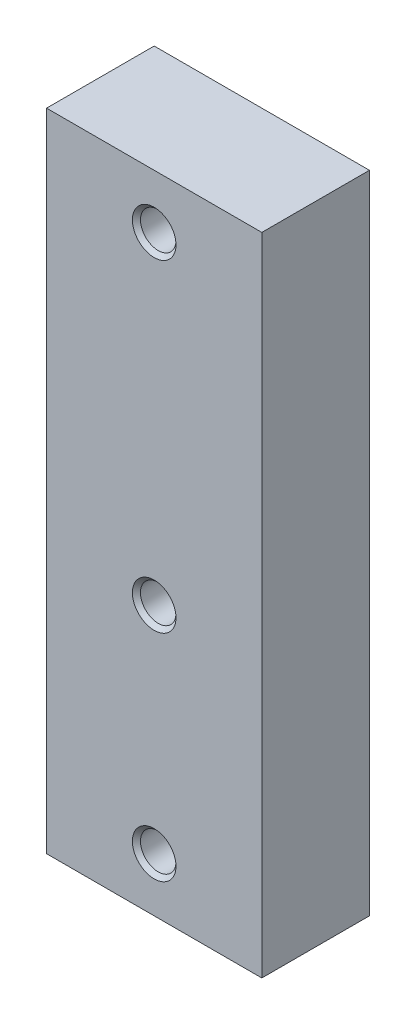
ISO-10303-21;
HEADER;
FILE_DESCRIPTION(('STEP AP214'),'2;1');
FILE_NAME('part.step','',(''),(''),'','','');
FILE_SCHEMA(('AUTOMOTIVE_DESIGN { 1 0 10303 214 1 1 1 1 }'));
ENDSEC;
DATA;
#1=APPLICATION_CONTEXT('core data for automotive mechanical design processes');
#2=APPLICATION_PROTOCOL_DEFINITION('international standard','automotive_design',2000,#1);
#3=PRODUCT_CONTEXT('',#1,'mechanical');
#4=PRODUCT('Part','Part','',(#3));
#5=PRODUCT_RELATED_PRODUCT_CATEGORY('part','',(#4));
#6=PRODUCT_DEFINITION_FORMATION('','',#4);
#7=PRODUCT_DEFINITION_CONTEXT('part definition',#1,'design');
#8=PRODUCT_DEFINITION('design','',#6,#7);
#9=PRODUCT_DEFINITION_SHAPE('','',#8);
#10=(LENGTH_UNIT() NAMED_UNIT(*) SI_UNIT(.MILLI.,.METRE.));
#11=(NAMED_UNIT(*) PLANE_ANGLE_UNIT() SI_UNIT($,.RADIAN.));
#12=(NAMED_UNIT(*) SI_UNIT($,.STERADIAN.) SOLID_ANGLE_UNIT());
#13=UNCERTAINTY_MEASURE_WITH_UNIT(LENGTH_MEASURE(1.E-05),#10,'distance_accuracy_value','');
#14=(GEOMETRIC_REPRESENTATION_CONTEXT(3) GLOBAL_UNCERTAINTY_ASSIGNED_CONTEXT((#13)) GLOBAL_UNIT_ASSIGNED_CONTEXT((#10,
#11,#12)) REPRESENTATION_CONTEXT('',''));
#15=CARTESIAN_POINT('',(0.,0.,0.));
#16=DIRECTION('',(0.,0.,1.));
#17=DIRECTION('',(1.,0.,0.));
#18=AXIS2_PLACEMENT_3D('',#15,#16,#17);
#19=CARTESIAN_POINT('',(0.,0.,0.));
#20=DIRECTION('',(0.,0.,-1.));
#21=DIRECTION('',(-1.,0.,0.));
#22=AXIS2_PLACEMENT_3D('',#19,#20,#21);
#23=PLANE('',#22);
#24=CARTESIAN_POINT('',(9.99999999999999,55.,0.));
#25=DIRECTION('',(0.,0.,1.));
#26=DIRECTION('',(1.,0.,0.));
#27=AXIS2_PLACEMENT_3D('',#24,#25,#26);
#28=CIRCLE('',#27,1.65);
#29=CARTESIAN_POINT('',(11.65,55.,0.));
#30=VERTEX_POINT('',#29);
#31=EDGE_CURVE('E125',#30,#30,#28,.T.);
#32=ORIENTED_EDGE('',*,*,#31,.T.);
#33=EDGE_LOOP('',(#32));
#34=FACE_BOUND('',#33,.T.);
#35=DIRECTION('',(0.,-1.,0.));
#36=VECTOR('',#35,1.);
#37=CARTESIAN_POINT('',(0.,0.,0.));
#38=LINE('',#37,#36);
#39=CARTESIAN_POINT('',(0.,60.,0.));
#40=VERTEX_POINT('',#39);
#41=CARTESIAN_POINT('',(0.,0.,0.));
#42=VERTEX_POINT('',#41);
#43=EDGE_CURVE('E146',#40,#42,#38,.T.);
#44=ORIENTED_EDGE('',*,*,#43,.F.);
#45=DIRECTION('',(-1.,0.,0.));
#46=VECTOR('',#45,1.);
#47=CARTESIAN_POINT('',(0.,60.,0.));
#48=LINE('',#47,#46);
#49=CARTESIAN_POINT('',(20.,60.,0.));
#50=VERTEX_POINT('',#49);
#51=EDGE_CURVE('E84',#50,#40,#48,.T.);
#52=ORIENTED_EDGE('',*,*,#51,.F.);
#53=DIRECTION('',(0.,1.,0.));
#54=VECTOR('',#53,1.);
#55=CARTESIAN_POINT('',(20.,0.,0.));
#56=LINE('',#55,#54);
#57=CARTESIAN_POINT('',(20.,0.,0.));
#58=VERTEX_POINT('',#57);
#59=EDGE_CURVE('E78',#58,#50,#56,.T.);
#60=ORIENTED_EDGE('',*,*,#59,.F.);
#61=DIRECTION('',(1.,0.,0.));
#62=VECTOR('',#61,1.);
#63=CARTESIAN_POINT('',(0.,0.,0.));
#64=LINE('',#63,#62);
#65=EDGE_CURVE('E156',#42,#58,#64,.T.);
#66=ORIENTED_EDGE('',*,*,#65,.F.);
#67=EDGE_LOOP('',(#44,#52,#60,#66));
#68=FACE_BOUND('',#67,.T.);
#69=CARTESIAN_POINT('',(9.99999999999999,5.,0.));
#70=DIRECTION('',(0.,0.,1.));
#71=DIRECTION('',(1.,0.,0.));
#72=AXIS2_PLACEMENT_3D('',#69,#70,#71);
#73=CIRCLE('',#72,1.65);
#74=CARTESIAN_POINT('',(11.65,5.,0.));
#75=VERTEX_POINT('',#74);
#76=EDGE_CURVE('E143',#75,#75,#73,.T.);
#77=ORIENTED_EDGE('',*,*,#76,.T.);
#78=EDGE_LOOP('',(#77));
#79=FACE_BOUND('',#78,.T.);
#80=CARTESIAN_POINT('',(9.99999999999999,25.,0.));
#81=DIRECTION('',(0.,0.,1.));
#82=DIRECTION('',(1.,0.,0.));
#83=AXIS2_PLACEMENT_3D('',#80,#81,#82);
#84=CIRCLE('',#83,1.65);
#85=CARTESIAN_POINT('',(11.65,25.,0.));
#86=VERTEX_POINT('',#85);
#87=EDGE_CURVE('E134',#86,#86,#84,.T.);
#88=ORIENTED_EDGE('',*,*,#87,.T.);
#89=EDGE_LOOP('',(#88));
#90=FACE_BOUND('',#89,.T.);
#91=ADVANCED_FACE('F43',(#34,#68,#79,#90),#23,.T.);
#92=CARTESIAN_POINT('',(0.,0.,10.));
#93=DIRECTION('',(1.,0.,0.));
#94=DIRECTION('',(0.,1.,0.));
#95=AXIS2_PLACEMENT_3D('',#92,#93,#94);
#96=PLANE('',#95);
#97=ORIENTED_EDGE('',*,*,#43,.T.);
#98=DIRECTION('',(0.,0.,-1.));
#99=VECTOR('',#98,1.);
#100=CARTESIAN_POINT('',(0.,0.,10.));
#101=LINE('',#100,#99);
#102=CARTESIAN_POINT('',(0.,0.,10.));
#103=VERTEX_POINT('',#102);
#104=EDGE_CURVE('E11',#103,#42,#101,.T.);
#105=ORIENTED_EDGE('',*,*,#104,.F.);
#106=DIRECTION('',(0.,-1.,0.));
#107=VECTOR('',#106,1.);
#108=CARTESIAN_POINT('',(0.,0.,10.));
#109=LINE('',#108,#107);
#110=CARTESIAN_POINT('',(0.,60.,10.));
#111=VERTEX_POINT('',#110);
#112=EDGE_CURVE('E147',#111,#103,#109,.T.);
#113=ORIENTED_EDGE('',*,*,#112,.F.);
#114=DIRECTION('',(0.,0.,-1.));
#115=VECTOR('',#114,1.);
#116=CARTESIAN_POINT('',(0.,60.,10.));
#117=LINE('',#116,#115);
#118=EDGE_CURVE('E153',#111,#40,#117,.T.);
#119=ORIENTED_EDGE('',*,*,#118,.T.);
#120=EDGE_LOOP('',(#97,#105,#113,#119));
#121=FACE_BOUND('',#120,.T.);
#122=ADVANCED_FACE('F45',(#121),#96,.F.);
#123=CARTESIAN_POINT('',(0.,0.,10.));
#124=DIRECTION('',(0.,1.,0.));
#125=DIRECTION('',(0.,0.,1.));
#126=AXIS2_PLACEMENT_3D('',#123,#124,#125);
#127=PLANE('',#126);
#128=CARTESIAN_POINT('',(15.,0.,5.13462493133506));
#129=DIRECTION('',(0.,-1.,0.));
#130=DIRECTION('',(0.,0.,-1.));
#131=AXIS2_PLACEMENT_3D('',#128,#129,#130);
#132=CIRCLE('',#131,1.64999999999999);
#133=CARTESIAN_POINT('',(15.,0.,3.48462493133508));
#134=VERTEX_POINT('',#133);
#135=EDGE_CURVE('E109',#134,#134,#132,.T.);
#136=ORIENTED_EDGE('',*,*,#135,.F.);
#137=EDGE_LOOP('',(#136));
#138=FACE_BOUND('',#137,.T.);
#139=CARTESIAN_POINT('',(5.,0.,5.13462493133506));
#140=DIRECTION('',(0.,-1.,0.));
#141=DIRECTION('',(0.,0.,-1.));
#142=AXIS2_PLACEMENT_3D('',#139,#140,#141);
#143=CIRCLE('',#142,1.64999999999999);
#144=CARTESIAN_POINT('',(5.,0.,3.48462493133507));
#145=VERTEX_POINT('',#144);
#146=EDGE_CURVE('E108',#145,#145,#143,.T.);
#147=ORIENTED_EDGE('',*,*,#146,.F.);
#148=EDGE_LOOP('',(#147));
#149=FACE_BOUND('',#148,.T.);
#150=ORIENTED_EDGE('',*,*,#65,.T.);
#151=DIRECTION('',(0.,0.,-1.));
#152=VECTOR('',#151,1.);
#153=CARTESIAN_POINT('',(20.,0.,10.));
#154=LINE('',#153,#152);
#155=CARTESIAN_POINT('',(20.,0.,10.));
#156=VERTEX_POINT('',#155);
#157=EDGE_CURVE('E52',#156,#58,#154,.T.);
#158=ORIENTED_EDGE('',*,*,#157,.F.);
#159=DIRECTION('',(1.,0.,0.));
#160=VECTOR('',#159,1.);
#161=CARTESIAN_POINT('',(0.,0.,10.));
#162=LINE('',#161,#160);
#163=EDGE_CURVE('E91',#103,#156,#162,.T.);
#164=ORIENTED_EDGE('',*,*,#163,.F.);
#165=ORIENTED_EDGE('',*,*,#104,.T.);
#166=EDGE_LOOP('',(#150,#158,#164,#165));
#167=FACE_BOUND('',#166,.T.);
#168=ADVANCED_FACE('F182',(#138,#149,#167),#127,.F.);
#169=CARTESIAN_POINT('',(20.,0.,10.));
#170=DIRECTION('',(-1.,0.,0.));
#171=DIRECTION('',(0.,-1.,0.));
#172=AXIS2_PLACEMENT_3D('',#169,#170,#171);
#173=PLANE('',#172);
#174=ORIENTED_EDGE('',*,*,#59,.T.);
#175=DIRECTION('',(0.,0.,-1.));
#176=VECTOR('',#175,1.);
#177=CARTESIAN_POINT('',(20.,60.,10.));
#178=LINE('',#177,#176);
#179=CARTESIAN_POINT('',(20.,60.,10.));
#180=VERTEX_POINT('',#179);
#181=EDGE_CURVE('E161',#180,#50,#178,.T.);
#182=ORIENTED_EDGE('',*,*,#181,.F.);
#183=DIRECTION('',(0.,1.,0.));
#184=VECTOR('',#183,1.);
#185=CARTESIAN_POINT('',(20.,0.,10.));
#186=LINE('',#185,#184);
#187=EDGE_CURVE('E150',#156,#180,#186,.T.);
#188=ORIENTED_EDGE('',*,*,#187,.F.);
#189=ORIENTED_EDGE('',*,*,#157,.T.);
#190=EDGE_LOOP('',(#174,#182,#188,#189));
#191=FACE_BOUND('',#190,.T.);
#192=ADVANCED_FACE('F163',(#191),#173,.F.);
#193=CARTESIAN_POINT('',(0.,60.,10.));
#194=DIRECTION('',(0.,-1.,0.));
#195=DIRECTION('',(0.,0.,-1.));
#196=AXIS2_PLACEMENT_3D('',#193,#194,#195);
#197=PLANE('',#196);
#198=ORIENTED_EDGE('',*,*,#51,.T.);
#199=ORIENTED_EDGE('',*,*,#118,.F.);
#200=DIRECTION('',(-1.,0.,0.));
#201=VECTOR('',#200,1.);
#202=CARTESIAN_POINT('',(0.,60.,10.));
#203=LINE('',#202,#201);
#204=EDGE_CURVE('E60',#180,#111,#203,.T.);
#205=ORIENTED_EDGE('',*,*,#204,.F.);
#206=ORIENTED_EDGE('',*,*,#181,.T.);
#207=EDGE_LOOP('',(#198,#199,#205,#206));
#208=FACE_BOUND('',#207,.T.);
#209=ADVANCED_FACE('F170',(#208),#197,.F.);
#210=CARTESIAN_POINT('',(0.,0.,10.));
#211=DIRECTION('',(0.,0.,-1.));
#212=DIRECTION('',(-1.,0.,0.));
#213=AXIS2_PLACEMENT_3D('',#210,#211,#212);
#214=PLANE('',#213);
#215=CARTESIAN_POINT('',(9.99999999999999,55.,10.));
#216=DIRECTION('',(0.,0.,1.));
#217=DIRECTION('',(1.,0.,0.));
#218=AXIS2_PLACEMENT_3D('',#215,#216,#217);
#219=CIRCLE('',#218,2.025);
#220=CARTESIAN_POINT('',(12.025,55.,10.));
#221=VERTEX_POINT('',#220);
#222=EDGE_CURVE('E119',#221,#221,#219,.T.);
#223=ORIENTED_EDGE('',*,*,#222,.F.);
#224=EDGE_LOOP('',(#223));
#225=FACE_BOUND('',#224,.T.);
#226=CARTESIAN_POINT('',(9.99999999999999,25.,10.));
#227=DIRECTION('',(0.,0.,1.));
#228=DIRECTION('',(1.,0.,0.));
#229=AXIS2_PLACEMENT_3D('',#226,#227,#228);
#230=CIRCLE('',#229,2.025);
#231=CARTESIAN_POINT('',(12.025,25.,10.));
#232=VERTEX_POINT('',#231);
#233=EDGE_CURVE('E128',#232,#232,#230,.T.);
#234=ORIENTED_EDGE('',*,*,#233,.F.);
#235=EDGE_LOOP('',(#234));
#236=FACE_BOUND('',#235,.T.);
#237=CARTESIAN_POINT('',(9.99999999999999,5.,10.));
#238=DIRECTION('',(0.,0.,1.));
#239=DIRECTION('',(1.,0.,0.));
#240=AXIS2_PLACEMENT_3D('',#237,#238,#239);
#241=CIRCLE('',#240,2.025);
#242=CARTESIAN_POINT('',(12.025,5.,10.));
#243=VERTEX_POINT('',#242);
#244=EDGE_CURVE('E137',#243,#243,#241,.T.);
#245=ORIENTED_EDGE('',*,*,#244,.F.);
#246=EDGE_LOOP('',(#245));
#247=FACE_BOUND('',#246,.T.);
#248=ORIENTED_EDGE('',*,*,#112,.T.);
#249=ORIENTED_EDGE('',*,*,#163,.T.);
#250=ORIENTED_EDGE('',*,*,#187,.T.);
#251=ORIENTED_EDGE('',*,*,#204,.T.);
#252=EDGE_LOOP('',(#248,#249,#250,#251));
#253=FACE_BOUND('',#252,.T.);
#254=ADVANCED_FACE('F172',(#225,#236,#247,#253),#214,.F.);
#255=CARTESIAN_POINT('',(9.99999999999999,5.,10.));
#256=DIRECTION('',(0.,0.,1.));
#257=DIRECTION('',(1.,0.,0.));
#258=AXIS2_PLACEMENT_3D('',#255,#256,#257);
#259=CYLINDRICAL_SURFACE('',#258,1.65);
#260=ORIENTED_EDGE('',*,*,#76,.F.);
#261=EDGE_LOOP('',(#260));
#262=FACE_BOUND('',#261,.T.);
#263=CARTESIAN_POINT('',(9.99999999999999,5.,9.625));
#264=DIRECTION('',(0.,0.,1.));
#265=DIRECTION('',(1.,0.,0.));
#266=AXIS2_PLACEMENT_3D('',#263,#264,#265);
#267=CIRCLE('',#266,1.65);
#268=CARTESIAN_POINT('',(11.65,5.,9.625));
#269=VERTEX_POINT('',#268);
#270=EDGE_CURVE('E140',#269,#269,#267,.T.);
#271=ORIENTED_EDGE('',*,*,#270,.T.);
#272=EDGE_LOOP('',(#271));
#273=FACE_BOUND('',#272,.T.);
#274=ADVANCED_FACE('F179',(#262,#273),#259,.F.);
#275=CARTESIAN_POINT('',(9.99999999999999,5.,10.));
#276=DIRECTION('',(0.,0.,1.));
#277=DIRECTION('',(1.,0.,0.));
#278=AXIS2_PLACEMENT_3D('',#275,#276,#277);
#279=CONICAL_SURFACE('',#278,2.025,0.785398163397453);
#280=ORIENTED_EDGE('',*,*,#270,.F.);
#281=EDGE_LOOP('',(#280));
#282=FACE_BOUND('',#281,.T.);
#283=ORIENTED_EDGE('',*,*,#244,.T.);
#284=EDGE_LOOP('',(#283));
#285=FACE_BOUND('',#284,.T.);
#286=ADVANCED_FACE('F192',(#282,#285),#279,.F.);
#287=CARTESIAN_POINT('',(9.99999999999999,25.,10.));
#288=DIRECTION('',(0.,0.,1.));
#289=DIRECTION('',(1.,0.,0.));
#290=AXIS2_PLACEMENT_3D('',#287,#288,#289);
#291=CYLINDRICAL_SURFACE('',#290,1.65);
#292=ORIENTED_EDGE('',*,*,#87,.F.);
#293=EDGE_LOOP('',(#292));
#294=FACE_BOUND('',#293,.T.);
#295=CARTESIAN_POINT('',(9.99999999999999,25.,9.625));
#296=DIRECTION('',(0.,0.,1.));
#297=DIRECTION('',(1.,0.,0.));
#298=AXIS2_PLACEMENT_3D('',#295,#296,#297);
#299=CIRCLE('',#298,1.65);
#300=CARTESIAN_POINT('',(11.65,25.,9.625));
#301=VERTEX_POINT('',#300);
#302=EDGE_CURVE('E131',#301,#301,#299,.T.);
#303=ORIENTED_EDGE('',*,*,#302,.T.);
#304=EDGE_LOOP('',(#303));
#305=FACE_BOUND('',#304,.T.);
#306=ADVANCED_FACE('F196',(#294,#305),#291,.F.);
#307=CARTESIAN_POINT('',(9.99999999999999,25.,10.));
#308=DIRECTION('',(0.,0.,1.));
#309=DIRECTION('',(1.,0.,0.));
#310=AXIS2_PLACEMENT_3D('',#307,#308,#309);
#311=CONICAL_SURFACE('',#310,2.025,0.785398163397451);
#312=ORIENTED_EDGE('',*,*,#302,.F.);
#313=EDGE_LOOP('',(#312));
#314=FACE_BOUND('',#313,.T.);
#315=ORIENTED_EDGE('',*,*,#233,.T.);
#316=EDGE_LOOP('',(#315));
#317=FACE_BOUND('',#316,.T.);
#318=ADVANCED_FACE('F200',(#314,#317),#311,.F.);
#319=CARTESIAN_POINT('',(9.99999999999999,55.,10.));
#320=DIRECTION('',(0.,0.,1.));
#321=DIRECTION('',(1.,0.,0.));
#322=AXIS2_PLACEMENT_3D('',#319,#320,#321);
#323=CYLINDRICAL_SURFACE('',#322,1.65);
#324=ORIENTED_EDGE('',*,*,#31,.F.);
#325=EDGE_LOOP('',(#324));
#326=FACE_BOUND('',#325,.T.);
#327=CARTESIAN_POINT('',(9.99999999999999,55.,9.625));
#328=DIRECTION('',(0.,0.,1.));
#329=DIRECTION('',(1.,0.,0.));
#330=AXIS2_PLACEMENT_3D('',#327,#328,#329);
#331=CIRCLE('',#330,1.65);
#332=CARTESIAN_POINT('',(11.65,55.,9.625));
#333=VERTEX_POINT('',#332);
#334=EDGE_CURVE('E122',#333,#333,#331,.T.);
#335=ORIENTED_EDGE('',*,*,#334,.T.);
#336=EDGE_LOOP('',(#335));
#337=FACE_BOUND('',#336,.T.);
#338=ADVANCED_FACE('F204',(#326,#337),#323,.F.);
#339=CARTESIAN_POINT('',(9.99999999999999,55.,10.));
#340=DIRECTION('',(0.,0.,1.));
#341=DIRECTION('',(1.,0.,0.));
#342=AXIS2_PLACEMENT_3D('',#339,#340,#341);
#343=CONICAL_SURFACE('',#342,2.025,0.785398163397453);
#344=ORIENTED_EDGE('',*,*,#334,.F.);
#345=EDGE_LOOP('',(#344));
#346=FACE_BOUND('',#345,.T.);
#347=ORIENTED_EDGE('',*,*,#222,.T.);
#348=EDGE_LOOP('',(#347));
#349=FACE_BOUND('',#348,.T.);
#350=ADVANCED_FACE('F208',(#346,#349),#343,.F.);
#351=CARTESIAN_POINT('',(5.,30.,5.13462493133506));
#352=DIRECTION('',(0.,-1.,0.));
#353=DIRECTION('',(0.,0.,-1.));
#354=AXIS2_PLACEMENT_3D('',#351,#352,#353);
#355=CONICAL_SURFACE('',#354,1.64999999999999,1.02974425867665);
#356=CARTESIAN_POINT('',(4.99999999999999,30.9914200213955,5.13462493133506));
#357=VERTEX_POINT('',#356);
#358=VERTEX_LOOP('',#357);
#359=FACE_BOUND('',#358,.T.);
#360=CARTESIAN_POINT('',(5.,30.,5.13462493133506));
#361=DIRECTION('',(0.,-1.,0.));
#362=DIRECTION('',(0.,0.,-1.));
#363=AXIS2_PLACEMENT_3D('',#360,#361,#362);
#364=CIRCLE('',#363,1.64999999999999);
#365=CARTESIAN_POINT('',(5.,30.,3.48462493133508));
#366=VERTEX_POINT('',#365);
#367=EDGE_CURVE('E112',#366,#366,#364,.T.);
#368=ORIENTED_EDGE('',*,*,#367,.T.);
#369=EDGE_LOOP('',(#368));
#370=FACE_BOUND('',#369,.T.);
#371=ADVANCED_FACE('F212',(#359,#370),#355,.F.);
#372=CARTESIAN_POINT('',(5.,0.,5.13462493133506));
#373=DIRECTION('',(0.,-1.,0.));
#374=DIRECTION('',(0.,0.,-1.));
#375=AXIS2_PLACEMENT_3D('',#372,#373,#374);
#376=CYLINDRICAL_SURFACE('',#375,1.64999999999999);
#377=ORIENTED_EDGE('',*,*,#367,.F.);
#378=EDGE_LOOP('',(#377));
#379=FACE_BOUND('',#378,.T.);
#380=ORIENTED_EDGE('',*,*,#146,.T.);
#381=EDGE_LOOP('',(#380));
#382=FACE_BOUND('',#381,.T.);
#383=ADVANCED_FACE('F102',(#379,#382),#376,.F.);
#384=CARTESIAN_POINT('',(15.,30.,5.13462493133506));
#385=DIRECTION('',(0.,-1.,0.));
#386=DIRECTION('',(0.,0.,-1.));
#387=AXIS2_PLACEMENT_3D('',#384,#385,#386);
#388=CONICAL_SURFACE('',#387,1.64999999999999,1.02974425867665);
#389=CARTESIAN_POINT('',(15.,30.9914200213955,5.13462493133506));
#390=VERTEX_POINT('',#389);
#391=VERTEX_LOOP('',#390);
#392=FACE_BOUND('',#391,.T.);
#393=CARTESIAN_POINT('',(15.,30.,5.13462493133506));
#394=DIRECTION('',(0.,-1.,0.));
#395=DIRECTION('',(0.,0.,-1.));
#396=AXIS2_PLACEMENT_3D('',#393,#394,#395);
#397=CIRCLE('',#396,1.64999999999999);
#398=CARTESIAN_POINT('',(15.,30.,3.48462493133508));
#399=VERTEX_POINT('',#398);
#400=EDGE_CURVE('E106',#399,#399,#397,.T.);
#401=ORIENTED_EDGE('',*,*,#400,.T.);
#402=EDGE_LOOP('',(#401));
#403=FACE_BOUND('',#402,.T.);
#404=ADVANCED_FACE('F98',(#392,#403),#388,.F.);
#405=CARTESIAN_POINT('',(15.,0.,5.13462493133506));
#406=DIRECTION('',(0.,-1.,0.));
#407=DIRECTION('',(0.,0.,-1.));
#408=AXIS2_PLACEMENT_3D('',#405,#406,#407);
#409=CYLINDRICAL_SURFACE('',#408,1.64999999999999);
#410=ORIENTED_EDGE('',*,*,#400,.F.);
#411=EDGE_LOOP('',(#410));
#412=FACE_BOUND('',#411,.T.);
#413=ORIENTED_EDGE('',*,*,#135,.T.);
#414=EDGE_LOOP('',(#413));
#415=FACE_BOUND('',#414,.T.);
#416=ADVANCED_FACE('F101',(#412,#415),#409,.F.);
#417=CLOSED_SHELL('',(#91,#122,#168,#192,#209,#254,#274,#286,#306,#318,#338,#350,#371,#383,#404,#416));
#418=MANIFOLD_SOLID_BREP('B2',#417);
#419=ADVANCED_BREP_SHAPE_REPRESENTATION('',(#18,#418),#14);
#420=SHAPE_DEFINITION_REPRESENTATION(#9,#419);
ENDSEC;
END-ISO-10303-21;
